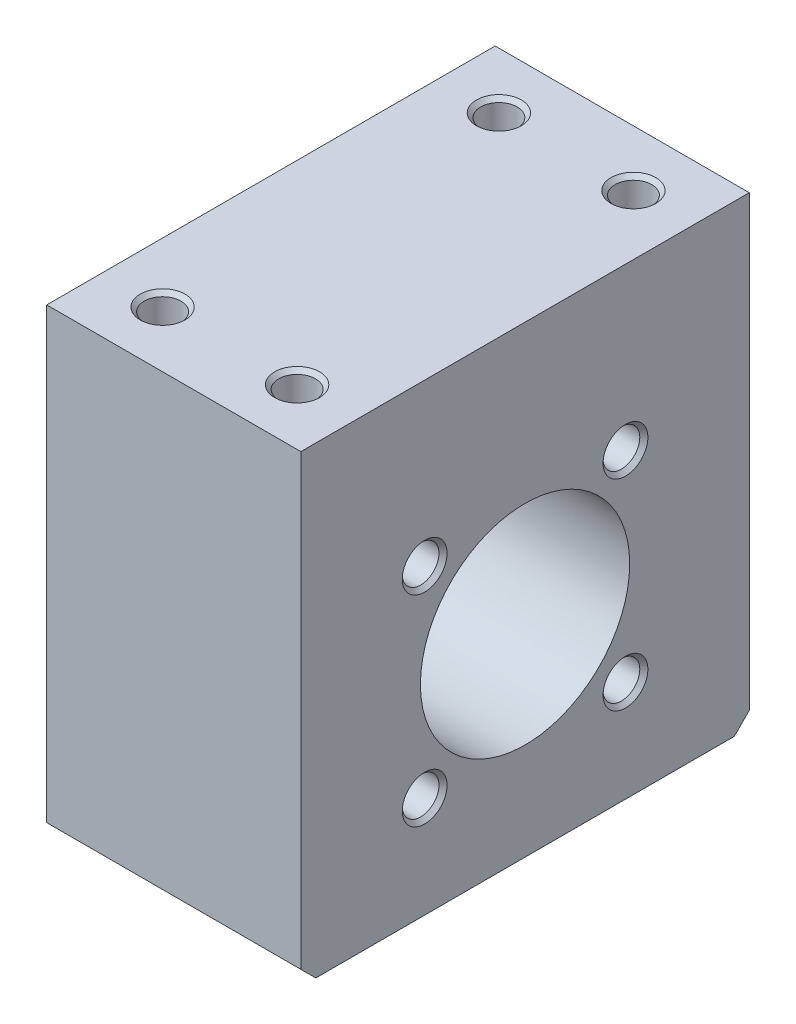
ISO-10303-21;
HEADER;
FILE_DESCRIPTION(('STEP AP214'),'2;1');
FILE_NAME('part.step','',(''),(''),'','','');
FILE_SCHEMA(('AUTOMOTIVE_DESIGN { 1 0 10303 214 1 1 1 1 }'));
ENDSEC;
DATA;
#1=APPLICATION_CONTEXT('core data for automotive mechanical design processes');
#2=APPLICATION_PROTOCOL_DEFINITION('international standard','automotive_design',2000,#1);
#3=PRODUCT_CONTEXT('',#1,'mechanical');
#4=PRODUCT('Part','Part','',(#3));
#5=PRODUCT_RELATED_PRODUCT_CATEGORY('part','',(#4));
#6=PRODUCT_DEFINITION_FORMATION('','',#4);
#7=PRODUCT_DEFINITION_CONTEXT('part definition',#1,'design');
#8=PRODUCT_DEFINITION('design','',#6,#7);
#9=PRODUCT_DEFINITION_SHAPE('','',#8);
#10=(LENGTH_UNIT() NAMED_UNIT(*) SI_UNIT(.MILLI.,.METRE.));
#11=(NAMED_UNIT(*) PLANE_ANGLE_UNIT() SI_UNIT($,.RADIAN.));
#12=(NAMED_UNIT(*) SI_UNIT($,.STERADIAN.) SOLID_ANGLE_UNIT());
#13=UNCERTAINTY_MEASURE_WITH_UNIT(LENGTH_MEASURE(1.E-05),#10,'distance_accuracy_value','');
#14=(GEOMETRIC_REPRESENTATION_CONTEXT(3) GLOBAL_UNCERTAINTY_ASSIGNED_CONTEXT((#13)) GLOBAL_UNIT_ASSIGNED_CONTEXT((#10,
#11,#12)) REPRESENTATION_CONTEXT('',''));
#15=CARTESIAN_POINT('',(0.,0.,0.));
#16=DIRECTION('',(0.,0.,1.));
#17=DIRECTION('',(1.,0.,0.));
#18=AXIS2_PLACEMENT_3D('',#15,#16,#17);
#19=CARTESIAN_POINT('',(-17.,-27.,30.));
#20=DIRECTION('',(0.,-1.,0.));
#21=DIRECTION('',(0.,0.,-1.));
#22=AXIS2_PLACEMENT_3D('',#19,#20,#21);
#23=PLANE('',#22);
#24=DIRECTION('',(0.,0.,-1.));
#25=VECTOR('',#24,1.);
#26=CARTESIAN_POINT('',(17.,-27.,30.));
#27=LINE('',#26,#25);
#28=CARTESIAN_POINT('',(17.,-27.,28.));
#29=VERTEX_POINT('',#28);
#30=CARTESIAN_POINT('',(17.,-27.,-28.));
#31=VERTEX_POINT('',#30);
#32=EDGE_CURVE('E149',#29,#31,#27,.T.);
#33=ORIENTED_EDGE('',*,*,#32,.F.);
#34=DIRECTION('',(-1.,0.,0.));
#35=VECTOR('',#34,1.);
#36=CARTESIAN_POINT('',(-17.,-27.,28.));
#37=LINE('',#36,#35);
#38=CARTESIAN_POINT('',(-17.,-27.,28.));
#39=VERTEX_POINT('',#38);
#40=EDGE_CURVE('E233',#29,#39,#37,.T.);
#41=ORIENTED_EDGE('',*,*,#40,.T.);
#42=DIRECTION('',(0.,0.,-1.));
#43=VECTOR('',#42,1.);
#44=CARTESIAN_POINT('',(-17.,-27.,30.));
#45=LINE('',#44,#43);
#46=CARTESIAN_POINT('',(-17.,-27.,-28.));
#47=VERTEX_POINT('',#46);
#48=EDGE_CURVE('E150',#39,#47,#45,.T.);
#49=ORIENTED_EDGE('',*,*,#48,.T.);
#50=DIRECTION('',(1.,0.,0.));
#51=VECTOR('',#50,1.);
#52=CARTESIAN_POINT('',(-17.,-27.,-28.));
#53=LINE('',#52,#51);
#54=EDGE_CURVE('E230',#47,#31,#53,.T.);
#55=ORIENTED_EDGE('',*,*,#54,.T.);
#56=EDGE_LOOP('',(#33,#41,#49,#55));
#57=FACE_BOUND('',#56,.T.);
#58=ADVANCED_FACE('F35',(#57),#23,.T.);
#59=CARTESIAN_POINT('',(-17.,35.,30.));
#60=DIRECTION('',(0.,0.,1.));
#61=DIRECTION('',(1.,0.,0.));
#62=AXIS2_PLACEMENT_3D('',#59,#60,#61);
#63=PLANE('',#62);
#64=DIRECTION('',(0.,-1.,0.));
#65=VECTOR('',#64,1.);
#66=CARTESIAN_POINT('',(-17.,35.,30.));
#67=LINE('',#66,#65);
#68=CARTESIAN_POINT('',(-17.,35.,30.));
#69=VERTEX_POINT('',#68);
#70=CARTESIAN_POINT('',(-17.,-25.,30.));
#71=VERTEX_POINT('',#70);
#72=EDGE_CURVE('E158',#69,#71,#67,.T.);
#73=ORIENTED_EDGE('',*,*,#72,.T.);
#74=DIRECTION('',(1.,0.,0.));
#75=VECTOR('',#74,1.);
#76=CARTESIAN_POINT('',(-17.,-25.,30.));
#77=LINE('',#76,#75);
#78=CARTESIAN_POINT('',(17.,-25.,30.));
#79=VERTEX_POINT('',#78);
#80=EDGE_CURVE('E223',#71,#79,#77,.T.);
#81=ORIENTED_EDGE('',*,*,#80,.T.);
#82=DIRECTION('',(0.,-1.,0.));
#83=VECTOR('',#82,1.);
#84=CARTESIAN_POINT('',(17.,35.,30.));
#85=LINE('',#84,#83);
#86=CARTESIAN_POINT('',(17.,35.,30.));
#87=VERTEX_POINT('',#86);
#88=EDGE_CURVE('E153',#87,#79,#85,.T.);
#89=ORIENTED_EDGE('',*,*,#88,.F.);
#90=DIRECTION('',(1.,0.,0.));
#91=VECTOR('',#90,1.);
#92=CARTESIAN_POINT('',(-17.,35.,30.));
#93=LINE('',#92,#91);
#94=EDGE_CURVE('E171',#69,#87,#93,.T.);
#95=ORIENTED_EDGE('',*,*,#94,.F.);
#96=EDGE_LOOP('',(#73,#81,#89,#95));
#97=FACE_BOUND('',#96,.T.);
#98=ADVANCED_FACE('F243',(#97),#63,.T.);
#99=CARTESIAN_POINT('',(-17.,35.,-30.));
#100=DIRECTION('',(0.,1.,0.));
#101=DIRECTION('',(0.,0.,1.));
#102=AXIS2_PLACEMENT_3D('',#99,#100,#101);
#103=PLANE('',#102);
#104=CARTESIAN_POINT('',(-9.,35.,22.5));
#105=DIRECTION('',(0.,1.,0.));
#106=DIRECTION('',(0.,0.,1.));
#107=AXIS2_PLACEMENT_3D('',#104,#105,#106);
#108=CIRCLE('',#107,3.00000000005395);
#109=CARTESIAN_POINT('',(-9.,35.,25.5000000000539));
#110=VERTEX_POINT('',#109);
#111=EDGE_CURVE('E187',#110,#110,#108,.F.);
#112=ORIENTED_EDGE('',*,*,#111,.T.);
#113=EDGE_LOOP('',(#112));
#114=FACE_BOUND('',#113,.T.);
#115=CARTESIAN_POINT('',(9.,35.,22.5));
#116=DIRECTION('',(0.,1.,0.));
#117=DIRECTION('',(0.,0.,1.));
#118=AXIS2_PLACEMENT_3D('',#115,#116,#117);
#119=CIRCLE('',#118,3.00000000005395);
#120=CARTESIAN_POINT('',(9.,35.,25.5000000000539));
#121=VERTEX_POINT('',#120);
#122=EDGE_CURVE('E184',#121,#121,#119,.F.);
#123=ORIENTED_EDGE('',*,*,#122,.T.);
#124=EDGE_LOOP('',(#123));
#125=FACE_BOUND('',#124,.T.);
#126=CARTESIAN_POINT('',(-9.,35.,-22.5));
#127=DIRECTION('',(0.,1.,0.));
#128=DIRECTION('',(0.,0.,1.));
#129=AXIS2_PLACEMENT_3D('',#126,#127,#128);
#130=CIRCLE('',#129,3.00000000005395);
#131=CARTESIAN_POINT('',(-9.,35.,-19.4999999999461));
#132=VERTEX_POINT('',#131);
#133=EDGE_CURVE('E181',#132,#132,#130,.F.);
#134=ORIENTED_EDGE('',*,*,#133,.T.);
#135=EDGE_LOOP('',(#134));
#136=FACE_BOUND('',#135,.T.);
#137=CARTESIAN_POINT('',(9.,35.,-22.5));
#138=DIRECTION('',(0.,1.,0.));
#139=DIRECTION('',(0.,0.,1.));
#140=AXIS2_PLACEMENT_3D('',#137,#138,#139);
#141=CIRCLE('',#140,3.00000000005395);
#142=CARTESIAN_POINT('',(9.,35.,-19.4999999999461));
#143=VERTEX_POINT('',#142);
#144=EDGE_CURVE('E178',#143,#143,#141,.F.);
#145=ORIENTED_EDGE('',*,*,#144,.T.);
#146=EDGE_LOOP('',(#145));
#147=FACE_BOUND('',#146,.T.);
#148=DIRECTION('',(0.,0.,1.));
#149=VECTOR('',#148,1.);
#150=CARTESIAN_POINT('',(17.,35.,-30.));
#151=LINE('',#150,#149);
#152=CARTESIAN_POINT('',(17.,35.,-30.));
#153=VERTEX_POINT('',#152);
#154=EDGE_CURVE('E166',#153,#87,#151,.T.);
#155=ORIENTED_EDGE('',*,*,#154,.F.);
#156=DIRECTION('',(1.,0.,0.));
#157=VECTOR('',#156,1.);
#158=CARTESIAN_POINT('',(-17.,35.,-30.));
#159=LINE('',#158,#157);
#160=CARTESIAN_POINT('',(-17.,35.,-30.));
#161=VERTEX_POINT('',#160);
#162=EDGE_CURVE('E161',#161,#153,#159,.T.);
#163=ORIENTED_EDGE('',*,*,#162,.F.);
#164=DIRECTION('',(0.,0.,1.));
#165=VECTOR('',#164,1.);
#166=CARTESIAN_POINT('',(-17.,35.,-30.));
#167=LINE('',#166,#165);
#168=EDGE_CURVE('E155',#161,#69,#167,.T.);
#169=ORIENTED_EDGE('',*,*,#168,.T.);
#170=ORIENTED_EDGE('',*,*,#94,.T.);
#171=EDGE_LOOP('',(#155,#163,#169,#170));
#172=FACE_BOUND('',#171,.T.);
#173=ADVANCED_FACE('F256',(#114,#125,#136,#147,#172),#103,.T.);
#174=CARTESIAN_POINT('',(-17.,-27.,-30.));
#175=DIRECTION('',(0.,0.,-1.));
#176=DIRECTION('',(-1.,0.,0.));
#177=AXIS2_PLACEMENT_3D('',#174,#175,#176);
#178=PLANE('',#177);
#179=DIRECTION('',(0.,1.,0.));
#180=VECTOR('',#179,1.);
#181=CARTESIAN_POINT('',(17.,-27.,-30.));
#182=LINE('',#181,#180);
#183=CARTESIAN_POINT('',(17.,-25.,-30.));
#184=VERTEX_POINT('',#183);
#185=EDGE_CURVE('E164',#184,#153,#182,.T.);
#186=ORIENTED_EDGE('',*,*,#185,.F.);
#187=DIRECTION('',(-1.,0.,0.));
#188=VECTOR('',#187,1.);
#189=CARTESIAN_POINT('',(-17.,-25.,-30.));
#190=LINE('',#189,#188);
#191=CARTESIAN_POINT('',(-17.,-25.,-30.));
#192=VERTEX_POINT('',#191);
#193=EDGE_CURVE('E11',#184,#192,#190,.T.);
#194=ORIENTED_EDGE('',*,*,#193,.T.);
#195=DIRECTION('',(0.,1.,0.));
#196=VECTOR('',#195,1.);
#197=CARTESIAN_POINT('',(-17.,-27.,-30.));
#198=LINE('',#197,#196);
#199=EDGE_CURVE('E152',#192,#161,#198,.T.);
#200=ORIENTED_EDGE('',*,*,#199,.T.);
#201=ORIENTED_EDGE('',*,*,#162,.T.);
#202=EDGE_LOOP('',(#186,#194,#200,#201));
#203=FACE_BOUND('',#202,.T.);
#204=ADVANCED_FACE('F252',(#203),#178,.T.);
#205=CARTESIAN_POINT('',(-17.,0.,0.));
#206=DIRECTION('',(1.,0.,0.));
#207=DIRECTION('',(0.,0.,-1.));
#208=AXIS2_PLACEMENT_3D('',#205,#206,#207);
#209=PLANE('',#208);
#210=CARTESIAN_POINT('',(-17.,0.,0.));
#211=DIRECTION('',(1.,0.,0.));
#212=DIRECTION('',(0.,0.,-1.));
#213=AXIS2_PLACEMENT_3D('',#210,#211,#212);
#214=CIRCLE('',#213,14.);
#215=CARTESIAN_POINT('',(-17.,0.,-14.));
#216=VERTEX_POINT('',#215);
#217=EDGE_CURVE('E146',#216,#216,#214,.T.);
#218=ORIENTED_EDGE('',*,*,#217,.T.);
#219=EDGE_LOOP('',(#218));
#220=FACE_BOUND('',#219,.T.);
#221=ORIENTED_EDGE('',*,*,#48,.F.);
#222=DIRECTION('',(0.,-0.707106781186546,-0.707106781186549));
#223=VECTOR('',#222,1.);
#224=CARTESIAN_POINT('',(-17.,-25.,30.));
#225=LINE('',#224,#223);
#226=EDGE_CURVE('E43',#39,#71,#225,.F.);
#227=ORIENTED_EDGE('',*,*,#226,.T.);
#228=ORIENTED_EDGE('',*,*,#72,.F.);
#229=ORIENTED_EDGE('',*,*,#168,.F.);
#230=ORIENTED_EDGE('',*,*,#199,.F.);
#231=DIRECTION('',(0.,0.70710678118655,-0.707106781186545));
#232=VECTOR('',#231,1.);
#233=CARTESIAN_POINT('',(-17.,-27.,-28.));
#234=LINE('',#233,#232);
#235=EDGE_CURVE('E55',#192,#47,#234,.F.);
#236=ORIENTED_EDGE('',*,*,#235,.T.);
#237=EDGE_LOOP('',(#221,#227,#228,#229,#230,#236));
#238=FACE_BOUND('',#237,.T.);
#239=ADVANCED_FACE('F237',(#220,#238),#209,.F.);
#240=CARTESIAN_POINT('',(17.,0.,0.));
#241=DIRECTION('',(1.,0.,0.));
#242=DIRECTION('',(0.,0.,-1.));
#243=AXIS2_PLACEMENT_3D('',#240,#241,#242);
#244=PLANE('',#243);
#245=CARTESIAN_POINT('',(17.,-13.4350288425444,13.4350288425444));
#246=DIRECTION('',(1.,0.,0.));
#247=DIRECTION('',(0.,0.,-1.));
#248=AXIS2_PLACEMENT_3D('',#245,#246,#247);
#249=CIRCLE('',#248,3.00000000005393);
#250=CARTESIAN_POINT('',(17.,-13.4350288425444,10.4350288424905));
#251=VERTEX_POINT('',#250);
#252=EDGE_CURVE('E205',#251,#251,#249,.F.);
#253=ORIENTED_EDGE('',*,*,#252,.T.);
#254=EDGE_LOOP('',(#253));
#255=FACE_BOUND('',#254,.T.);
#256=CARTESIAN_POINT('',(17.,-13.4350288425444,-13.4350288425444));
#257=DIRECTION('',(1.,0.,0.));
#258=DIRECTION('',(0.,0.,-1.));
#259=AXIS2_PLACEMENT_3D('',#256,#257,#258);
#260=CIRCLE('',#259,3.00000000005393);
#261=CARTESIAN_POINT('',(17.,-13.4350288425444,-16.4350288425983));
#262=VERTEX_POINT('',#261);
#263=EDGE_CURVE('E202',#262,#262,#260,.F.);
#264=ORIENTED_EDGE('',*,*,#263,.T.);
#265=EDGE_LOOP('',(#264));
#266=FACE_BOUND('',#265,.T.);
#267=CARTESIAN_POINT('',(17.,13.4350288425444,13.4350288425444));
#268=DIRECTION('',(1.,0.,0.));
#269=DIRECTION('',(0.,0.,-1.));
#270=AXIS2_PLACEMENT_3D('',#267,#268,#269);
#271=CIRCLE('',#270,3.00000000005393);
#272=CARTESIAN_POINT('',(17.,13.4350288425444,10.4350288424905));
#273=VERTEX_POINT('',#272);
#274=EDGE_CURVE('E199',#273,#273,#271,.F.);
#275=ORIENTED_EDGE('',*,*,#274,.T.);
#276=EDGE_LOOP('',(#275));
#277=FACE_BOUND('',#276,.T.);
#278=CARTESIAN_POINT('',(17.,13.4350288425444,-13.4350288425444));
#279=DIRECTION('',(1.,0.,0.));
#280=DIRECTION('',(0.,0.,-1.));
#281=AXIS2_PLACEMENT_3D('',#278,#279,#280);
#282=CIRCLE('',#281,3.00000000005393);
#283=CARTESIAN_POINT('',(17.,13.4350288425444,-16.4350288425983));
#284=VERTEX_POINT('',#283);
#285=EDGE_CURVE('E196',#284,#284,#282,.F.);
#286=ORIENTED_EDGE('',*,*,#285,.T.);
#287=EDGE_LOOP('',(#286));
#288=FACE_BOUND('',#287,.T.);
#289=CARTESIAN_POINT('',(17.,0.,0.));
#290=DIRECTION('',(1.,0.,0.));
#291=DIRECTION('',(0.,0.,-1.));
#292=AXIS2_PLACEMENT_3D('',#289,#290,#291);
#293=CIRCLE('',#292,14.);
#294=CARTESIAN_POINT('',(17.,0.,-14.));
#295=VERTEX_POINT('',#294);
#296=EDGE_CURVE('E143',#295,#295,#293,.T.);
#297=ORIENTED_EDGE('',*,*,#296,.F.);
#298=EDGE_LOOP('',(#297));
#299=FACE_BOUND('',#298,.T.);
#300=ORIENTED_EDGE('',*,*,#88,.T.);
#301=DIRECTION('',(0.,0.707106781186546,0.707106781186549));
#302=VECTOR('',#301,1.);
#303=CARTESIAN_POINT('',(17.,-27.5000000000001,27.4999999999999));
#304=LINE('',#303,#302);
#305=EDGE_CURVE('E228',#79,#29,#304,.F.);
#306=ORIENTED_EDGE('',*,*,#305,.T.);
#307=ORIENTED_EDGE('',*,*,#32,.T.);
#308=DIRECTION('',(0.,-0.70710678118655,0.707106781186545));
#309=VECTOR('',#308,1.);
#310=CARTESIAN_POINT('',(17.,-27.4999999999999,-27.5000000000001));
#311=LINE('',#310,#309);
#312=EDGE_CURVE('E226',#31,#184,#311,.F.);
#313=ORIENTED_EDGE('',*,*,#312,.T.);
#314=ORIENTED_EDGE('',*,*,#185,.T.);
#315=ORIENTED_EDGE('',*,*,#154,.T.);
#316=EDGE_LOOP('',(#300,#306,#307,#313,#314,#315));
#317=FACE_BOUND('',#316,.T.);
#318=ADVANCED_FACE('F248',(#255,#266,#277,#288,#299,#317),#244,.T.);
#319=CARTESIAN_POINT('',(17.,0.,0.));
#320=DIRECTION('',(1.,0.,0.));
#321=DIRECTION('',(0.,0.,-1.));
#322=AXIS2_PLACEMENT_3D('',#319,#320,#321);
#323=CYLINDRICAL_SURFACE('',#322,14.);
#324=ORIENTED_EDGE('',*,*,#217,.F.);
#325=EDGE_LOOP('',(#324));
#326=FACE_BOUND('',#325,.T.);
#327=ORIENTED_EDGE('',*,*,#296,.T.);
#328=EDGE_LOOP('',(#327));
#329=FACE_BOUND('',#328,.T.);
#330=ADVANCED_FACE('F323',(#326,#329),#323,.F.);
#331=CARTESIAN_POINT('',(-9.,20.6873648292338,22.5));
#332=DIRECTION('',(0.,1.,0.));
#333=DIRECTION('',(0.,0.,1.));
#334=AXIS2_PLACEMENT_3D('',#331,#332,#333);
#335=CONICAL_SURFACE('',#334,2.4585,1.04719755108974);
#336=CARTESIAN_POINT('',(-9.,19.2679491920808,22.5));
#337=VERTEX_POINT('',#336);
#338=VERTEX_LOOP('',#337);
#339=FACE_BOUND('',#338,.T.);
#340=CARTESIAN_POINT('',(-9.,20.6873648292338,22.5));
#341=DIRECTION('',(0.,1.,0.));
#342=DIRECTION('',(0.,0.,1.));
#343=AXIS2_PLACEMENT_3D('',#340,#341,#342);
#344=CIRCLE('',#343,2.4585);
#345=CARTESIAN_POINT('',(-9.,20.6873648292338,24.9585));
#346=VERTEX_POINT('',#345);
#347=EDGE_CURVE('E140',#346,#346,#344,.T.);
#348=ORIENTED_EDGE('',*,*,#347,.T.);
#349=EDGE_LOOP('',(#348));
#350=FACE_BOUND('',#349,.T.);
#351=ADVANCED_FACE('F495',(#339,#350),#335,.F.);
#352=CARTESIAN_POINT('',(-9.,35.,22.5));
#353=DIRECTION('',(0.,1.,0.));
#354=DIRECTION('',(0.,0.,1.));
#355=AXIS2_PLACEMENT_3D('',#352,#353,#354);
#356=CYLINDRICAL_SURFACE('',#355,2.4585);
#357=CARTESIAN_POINT('',(-9.,34.4584999999461,22.5));
#358=DIRECTION('',(0.,1.,0.));
#359=DIRECTION('',(0.,0.,1.));
#360=AXIS2_PLACEMENT_3D('',#357,#358,#359);
#361=CIRCLE('',#360,2.4585);
#362=CARTESIAN_POINT('',(-9.,34.4584999999461,24.9585));
#363=VERTEX_POINT('',#362);
#364=EDGE_CURVE('E173',#363,#363,#361,.T.);
#365=ORIENTED_EDGE('',*,*,#364,.T.);
#366=EDGE_LOOP('',(#365));
#367=FACE_BOUND('',#366,.T.);
#368=ORIENTED_EDGE('',*,*,#347,.F.);
#369=EDGE_LOOP('',(#368));
#370=FACE_BOUND('',#369,.T.);
#371=ADVANCED_FACE('F491',(#367,#370),#356,.F.);
#372=CARTESIAN_POINT('',(-9.,20.6873648292338,-22.5));
#373=DIRECTION('',(0.,1.,0.));
#374=DIRECTION('',(0.,0.,1.));
#375=AXIS2_PLACEMENT_3D('',#372,#373,#374);
#376=CONICAL_SURFACE('',#375,2.4585,1.04719755108974);
#377=CARTESIAN_POINT('',(-9.,19.2679491920808,-22.5));
#378=VERTEX_POINT('',#377);
#379=VERTEX_LOOP('',#378);
#380=FACE_BOUND('',#379,.T.);
#381=CARTESIAN_POINT('',(-9.,20.6873648292338,-22.5));
#382=DIRECTION('',(0.,1.,0.));
#383=DIRECTION('',(0.,0.,1.));
#384=AXIS2_PLACEMENT_3D('',#381,#382,#383);
#385=CIRCLE('',#384,2.4585);
#386=CARTESIAN_POINT('',(-9.,20.6873648292338,-20.0415));
#387=VERTEX_POINT('',#386);
#388=EDGE_CURVE('E137',#387,#387,#385,.T.);
#389=ORIENTED_EDGE('',*,*,#388,.T.);
#390=EDGE_LOOP('',(#389));
#391=FACE_BOUND('',#390,.T.);
#392=ADVANCED_FACE('F483',(#380,#391),#376,.F.);
#393=CARTESIAN_POINT('',(-9.,35.,-22.5));
#394=DIRECTION('',(0.,1.,0.));
#395=DIRECTION('',(0.,0.,1.));
#396=AXIS2_PLACEMENT_3D('',#393,#394,#395);
#397=CYLINDRICAL_SURFACE('',#396,2.4585);
#398=CARTESIAN_POINT('',(-9.,34.4584999999461,-22.5));
#399=DIRECTION('',(0.,1.,0.));
#400=DIRECTION('',(0.,0.,1.));
#401=AXIS2_PLACEMENT_3D('',#398,#399,#400);
#402=CIRCLE('',#401,2.4585);
#403=CARTESIAN_POINT('',(-9.,34.4584999999461,-20.0415));
#404=VERTEX_POINT('',#403);
#405=EDGE_CURVE('E208',#404,#404,#402,.T.);
#406=ORIENTED_EDGE('',*,*,#405,.T.);
#407=EDGE_LOOP('',(#406));
#408=FACE_BOUND('',#407,.T.);
#409=ORIENTED_EDGE('',*,*,#388,.F.);
#410=EDGE_LOOP('',(#409));
#411=FACE_BOUND('',#410,.T.);
#412=ADVANCED_FACE('F478',(#408,#411),#397,.F.);
#413=CARTESIAN_POINT('',(9.,20.6873648292338,22.5));
#414=DIRECTION('',(0.,1.,0.));
#415=DIRECTION('',(0.,0.,1.));
#416=AXIS2_PLACEMENT_3D('',#413,#414,#415);
#417=CONICAL_SURFACE('',#416,2.4585,1.04719755108974);
#418=CARTESIAN_POINT('',(9.,19.2679491920808,22.5));
#419=VERTEX_POINT('',#418);
#420=VERTEX_LOOP('',#419);
#421=FACE_BOUND('',#420,.T.);
#422=CARTESIAN_POINT('',(9.,20.6873648292338,22.5));
#423=DIRECTION('',(0.,1.,0.));
#424=DIRECTION('',(0.,0.,1.));
#425=AXIS2_PLACEMENT_3D('',#422,#423,#424);
#426=CIRCLE('',#425,2.4585);
#427=CARTESIAN_POINT('',(9.,20.6873648292338,24.9585));
#428=VERTEX_POINT('',#427);
#429=EDGE_CURVE('E134',#428,#428,#426,.T.);
#430=ORIENTED_EDGE('',*,*,#429,.T.);
#431=EDGE_LOOP('',(#430));
#432=FACE_BOUND('',#431,.T.);
#433=ADVANCED_FACE('F470',(#421,#432),#417,.F.);
#434=CARTESIAN_POINT('',(9.,35.,22.5));
#435=DIRECTION('',(0.,1.,0.));
#436=DIRECTION('',(0.,0.,1.));
#437=AXIS2_PLACEMENT_3D('',#434,#435,#436);
#438=CYLINDRICAL_SURFACE('',#437,2.4585);
#439=CARTESIAN_POINT('',(9.,34.4584999999461,22.5));
#440=DIRECTION('',(0.,1.,0.));
#441=DIRECTION('',(0.,0.,1.));
#442=AXIS2_PLACEMENT_3D('',#439,#440,#441);
#443=CIRCLE('',#442,2.4585);
#444=CARTESIAN_POINT('',(9.,34.4584999999461,24.9585));
#445=VERTEX_POINT('',#444);
#446=EDGE_CURVE('E190',#445,#445,#443,.T.);
#447=ORIENTED_EDGE('',*,*,#446,.T.);
#448=EDGE_LOOP('',(#447));
#449=FACE_BOUND('',#448,.T.);
#450=ORIENTED_EDGE('',*,*,#429,.F.);
#451=EDGE_LOOP('',(#450));
#452=FACE_BOUND('',#451,.T.);
#453=ADVANCED_FACE('F465',(#449,#452),#438,.F.);
#454=CARTESIAN_POINT('',(9.,20.6873648292338,-22.5));
#455=DIRECTION('',(0.,1.,0.));
#456=DIRECTION('',(0.,0.,1.));
#457=AXIS2_PLACEMENT_3D('',#454,#455,#456);
#458=CONICAL_SURFACE('',#457,2.4585,1.04719755108974);
#459=CARTESIAN_POINT('',(9.,19.2679491920808,-22.5));
#460=VERTEX_POINT('',#459);
#461=VERTEX_LOOP('',#460);
#462=FACE_BOUND('',#461,.T.);
#463=CARTESIAN_POINT('',(9.,20.6873648292338,-22.5));
#464=DIRECTION('',(0.,1.,0.));
#465=DIRECTION('',(0.,0.,1.));
#466=AXIS2_PLACEMENT_3D('',#463,#464,#465);
#467=CIRCLE('',#466,2.4585);
#468=CARTESIAN_POINT('',(9.,20.6873648292338,-20.0415));
#469=VERTEX_POINT('',#468);
#470=EDGE_CURVE('E131',#469,#469,#467,.T.);
#471=ORIENTED_EDGE('',*,*,#470,.T.);
#472=EDGE_LOOP('',(#471));
#473=FACE_BOUND('',#472,.T.);
#474=ADVANCED_FACE('F457',(#462,#473),#458,.F.);
#475=CARTESIAN_POINT('',(9.,35.,-22.5));
#476=DIRECTION('',(0.,1.,0.));
#477=DIRECTION('',(0.,0.,1.));
#478=AXIS2_PLACEMENT_3D('',#475,#476,#477);
#479=CYLINDRICAL_SURFACE('',#478,2.4585);
#480=CARTESIAN_POINT('',(9.,34.4584999999461,-22.5));
#481=DIRECTION('',(0.,1.,0.));
#482=DIRECTION('',(0.,0.,1.));
#483=AXIS2_PLACEMENT_3D('',#480,#481,#482);
#484=CIRCLE('',#483,2.4585);
#485=CARTESIAN_POINT('',(9.,34.4584999999461,-20.0415));
#486=VERTEX_POINT('',#485);
#487=EDGE_CURVE('E220',#486,#486,#484,.T.);
#488=ORIENTED_EDGE('',*,*,#487,.T.);
#489=EDGE_LOOP('',(#488));
#490=FACE_BOUND('',#489,.T.);
#491=ORIENTED_EDGE('',*,*,#470,.F.);
#492=EDGE_LOOP('',(#491));
#493=FACE_BOUND('',#492,.T.);
#494=ADVANCED_FACE('F452',(#490,#493),#479,.F.);
#495=CARTESIAN_POINT('',(4.68736482923382,13.4350288425444,13.4350288425444));
#496=DIRECTION('',(1.,0.,0.));
#497=DIRECTION('',(0.,0.,-1.));
#498=AXIS2_PLACEMENT_3D('',#495,#496,#497);
#499=CONICAL_SURFACE('',#498,2.4585,1.04719755105556);
#500=CARTESIAN_POINT('',(3.26794919196881,13.4350288425444,13.4350288425444));
#501=VERTEX_POINT('',#500);
#502=VERTEX_LOOP('',#501);
#503=FACE_BOUND('',#502,.T.);
#504=CARTESIAN_POINT('',(4.68736482923382,13.4350288425444,13.4350288425444));
#505=DIRECTION('',(1.,0.,0.));
#506=DIRECTION('',(0.,0.,-1.));
#507=AXIS2_PLACEMENT_3D('',#504,#505,#506);
#508=CIRCLE('',#507,2.4585);
#509=CARTESIAN_POINT('',(4.68736482923382,13.4350288425444,10.9765288425444));
#510=VERTEX_POINT('',#509);
#511=EDGE_CURVE('E128',#510,#510,#508,.T.);
#512=ORIENTED_EDGE('',*,*,#511,.T.);
#513=EDGE_LOOP('',(#512));
#514=FACE_BOUND('',#513,.T.);
#515=ADVANCED_FACE('F444',(#503,#514),#499,.F.);
#516=CARTESIAN_POINT('',(17.,13.4350288425444,13.4350288425444));
#517=DIRECTION('',(1.,0.,0.));
#518=DIRECTION('',(0.,0.,-1.));
#519=AXIS2_PLACEMENT_3D('',#516,#517,#518);
#520=CYLINDRICAL_SURFACE('',#519,2.4585);
#521=CARTESIAN_POINT('',(16.4584999999461,13.4350288425444,13.4350288425444));
#522=DIRECTION('',(1.,0.,0.));
#523=DIRECTION('',(0.,0.,-1.));
#524=AXIS2_PLACEMENT_3D('',#521,#522,#523);
#525=CIRCLE('',#524,2.4585);
#526=CARTESIAN_POINT('',(16.4584999999461,13.4350288425444,10.9765288425444));
#527=VERTEX_POINT('',#526);
#528=EDGE_CURVE('E214',#527,#527,#525,.T.);
#529=ORIENTED_EDGE('',*,*,#528,.T.);
#530=EDGE_LOOP('',(#529));
#531=FACE_BOUND('',#530,.T.);
#532=ORIENTED_EDGE('',*,*,#511,.F.);
#533=EDGE_LOOP('',(#532));
#534=FACE_BOUND('',#533,.T.);
#535=ADVANCED_FACE('F439',(#531,#534),#520,.F.);
#536=CARTESIAN_POINT('',(4.68736482923382,-13.4350288425444,-13.4350288425444));
#537=DIRECTION('',(1.,0.,0.));
#538=DIRECTION('',(0.,0.,-1.));
#539=AXIS2_PLACEMENT_3D('',#536,#537,#538);
#540=CONICAL_SURFACE('',#539,2.4585,1.04719755105556);
#541=CARTESIAN_POINT('',(3.26794919196881,-13.4350288425444,-13.4350288425444));
#542=VERTEX_POINT('',#541);
#543=VERTEX_LOOP('',#542);
#544=FACE_BOUND('',#543,.T.);
#545=CARTESIAN_POINT('',(4.68736482923382,-13.4350288425444,-13.4350288425444));
#546=DIRECTION('',(1.,0.,0.));
#547=DIRECTION('',(0.,0.,-1.));
#548=AXIS2_PLACEMENT_3D('',#545,#546,#547);
#549=CIRCLE('',#548,2.4585);
#550=CARTESIAN_POINT('',(4.68736482923382,-13.4350288425444,-15.8935288425444));
#551=VERTEX_POINT('',#550);
#552=EDGE_CURVE('E123',#551,#551,#549,.T.);
#553=ORIENTED_EDGE('',*,*,#552,.T.);
#554=EDGE_LOOP('',(#553));
#555=FACE_BOUND('',#554,.T.);
#556=ADVANCED_FACE('F431',(#544,#555),#540,.F.);
#557=CARTESIAN_POINT('',(17.,-13.4350288425444,-13.4350288425444));
#558=DIRECTION('',(1.,0.,0.));
#559=DIRECTION('',(0.,0.,-1.));
#560=AXIS2_PLACEMENT_3D('',#557,#558,#559);
#561=CYLINDRICAL_SURFACE('',#560,2.4585);
#562=CARTESIAN_POINT('',(16.4584999999461,-13.4350288425444,-13.4350288425444));
#563=DIRECTION('',(1.,0.,0.));
#564=DIRECTION('',(0.,0.,-1.));
#565=AXIS2_PLACEMENT_3D('',#562,#563,#564);
#566=CIRCLE('',#565,2.4585);
#567=CARTESIAN_POINT('',(16.4584999999461,-13.4350288425444,-15.8935288425444));
#568=VERTEX_POINT('',#567);
#569=EDGE_CURVE('E211',#568,#568,#566,.T.);
#570=ORIENTED_EDGE('',*,*,#569,.T.);
#571=EDGE_LOOP('',(#570));
#572=FACE_BOUND('',#571,.T.);
#573=ORIENTED_EDGE('',*,*,#552,.F.);
#574=EDGE_LOOP('',(#573));
#575=FACE_BOUND('',#574,.T.);
#576=ADVANCED_FACE('F426',(#572,#575),#561,.F.);
#577=CARTESIAN_POINT('',(4.68736482923382,-13.4350288425444,13.4350288425444));
#578=DIRECTION('',(1.,0.,0.));
#579=DIRECTION('',(0.,0.,-1.));
#580=AXIS2_PLACEMENT_3D('',#577,#578,#579);
#581=CONICAL_SURFACE('',#580,2.4585,1.04719755105556);
#582=CARTESIAN_POINT('',(3.26794919196881,-13.4350288425444,13.4350288425444));
#583=VERTEX_POINT('',#582);
#584=VERTEX_LOOP('',#583);
#585=FACE_BOUND('',#584,.T.);
#586=CARTESIAN_POINT('',(4.68736482923382,-13.4350288425444,13.4350288425444));
#587=DIRECTION('',(1.,0.,0.));
#588=DIRECTION('',(0.,0.,-1.));
#589=AXIS2_PLACEMENT_3D('',#586,#587,#588);
#590=CIRCLE('',#589,2.4585);
#591=CARTESIAN_POINT('',(4.68736482923382,-13.4350288425444,10.9765288425444));
#592=VERTEX_POINT('',#591);
#593=EDGE_CURVE('E120',#592,#592,#590,.T.);
#594=ORIENTED_EDGE('',*,*,#593,.T.);
#595=EDGE_LOOP('',(#594));
#596=FACE_BOUND('',#595,.T.);
#597=ADVANCED_FACE('F418',(#585,#596),#581,.F.);
#598=CARTESIAN_POINT('',(17.,-13.4350288425444,13.4350288425444));
#599=DIRECTION('',(1.,0.,0.));
#600=DIRECTION('',(0.,0.,-1.));
#601=AXIS2_PLACEMENT_3D('',#598,#599,#600);
#602=CYLINDRICAL_SURFACE('',#601,2.4585);
#603=CARTESIAN_POINT('',(16.4584999999461,-13.4350288425444,13.4350288425444));
#604=DIRECTION('',(1.,0.,0.));
#605=DIRECTION('',(0.,0.,-1.));
#606=AXIS2_PLACEMENT_3D('',#603,#604,#605);
#607=CIRCLE('',#606,2.4585);
#608=CARTESIAN_POINT('',(16.4584999999461,-13.4350288425444,10.9765288425444));
#609=VERTEX_POINT('',#608);
#610=EDGE_CURVE('E193',#609,#609,#607,.T.);
#611=ORIENTED_EDGE('',*,*,#610,.T.);
#612=EDGE_LOOP('',(#611));
#613=FACE_BOUND('',#612,.T.);
#614=ORIENTED_EDGE('',*,*,#593,.F.);
#615=EDGE_LOOP('',(#614));
#616=FACE_BOUND('',#615,.T.);
#617=ADVANCED_FACE('F114',(#613,#616),#602,.F.);
#618=CARTESIAN_POINT('',(4.68736482923382,13.4350288425444,-13.4350288425444));
#619=DIRECTION('',(1.,0.,0.));
#620=DIRECTION('',(0.,0.,-1.));
#621=AXIS2_PLACEMENT_3D('',#618,#619,#620);
#622=CONICAL_SURFACE('',#621,2.4585,1.04719755105556);
#623=CARTESIAN_POINT('',(3.26794919196881,13.4350288425444,-13.4350288425444));
#624=VERTEX_POINT('',#623);
#625=VERTEX_LOOP('',#624);
#626=FACE_BOUND('',#625,.T.);
#627=CARTESIAN_POINT('',(4.68736482923382,13.4350288425444,-13.4350288425444));
#628=DIRECTION('',(1.,0.,0.));
#629=DIRECTION('',(0.,0.,-1.));
#630=AXIS2_PLACEMENT_3D('',#627,#628,#629);
#631=CIRCLE('',#630,2.4585);
#632=CARTESIAN_POINT('',(4.68736482923382,13.4350288425444,-15.8935288425444));
#633=VERTEX_POINT('',#632);
#634=EDGE_CURVE('E118',#633,#633,#631,.T.);
#635=ORIENTED_EDGE('',*,*,#634,.T.);
#636=EDGE_LOOP('',(#635));
#637=FACE_BOUND('',#636,.T.);
#638=ADVANCED_FACE('F110',(#626,#637),#622,.F.);
#639=CARTESIAN_POINT('',(17.,13.4350288425444,-13.4350288425444));
#640=DIRECTION('',(1.,0.,0.));
#641=DIRECTION('',(0.,0.,-1.));
#642=AXIS2_PLACEMENT_3D('',#639,#640,#641);
#643=CYLINDRICAL_SURFACE('',#642,2.4585);
#644=CARTESIAN_POINT('',(16.4584999999461,13.4350288425444,-13.4350288425444));
#645=DIRECTION('',(1.,0.,0.));
#646=DIRECTION('',(0.,0.,-1.));
#647=AXIS2_PLACEMENT_3D('',#644,#645,#646);
#648=CIRCLE('',#647,2.4585);
#649=CARTESIAN_POINT('',(16.4584999999461,13.4350288425444,-15.8935288425444));
#650=VERTEX_POINT('',#649);
#651=EDGE_CURVE('E217',#650,#650,#648,.T.);
#652=ORIENTED_EDGE('',*,*,#651,.T.);
#653=EDGE_LOOP('',(#652));
#654=FACE_BOUND('',#653,.T.);
#655=ORIENTED_EDGE('',*,*,#634,.F.);
#656=EDGE_LOOP('',(#655));
#657=FACE_BOUND('',#656,.T.);
#658=ADVANCED_FACE('F113',(#654,#657),#643,.F.);
#659=CARTESIAN_POINT('',(-9.,34.4584999999461,22.5));
#660=DIRECTION('',(0.,1.,0.));
#661=DIRECTION('',(0.,0.,1.));
#662=AXIS2_PLACEMENT_3D('',#659,#660,#661);
#663=CONICAL_SURFACE('',#662,2.4585,0.785398163397446);
#664=ORIENTED_EDGE('',*,*,#111,.F.);
#665=EDGE_LOOP('',(#664));
#666=FACE_BOUND('',#665,.T.);
#667=ORIENTED_EDGE('',*,*,#364,.F.);
#668=EDGE_LOOP('',(#667));
#669=FACE_BOUND('',#668,.T.);
#670=ADVANCED_FACE('F272',(#666,#669),#663,.F.);
#671=CARTESIAN_POINT('',(9.,34.4584999999461,22.5));
#672=DIRECTION('',(0.,1.,0.));
#673=DIRECTION('',(0.,0.,1.));
#674=AXIS2_PLACEMENT_3D('',#671,#672,#673);
#675=CONICAL_SURFACE('',#674,2.4585,0.785398163397446);
#676=ORIENTED_EDGE('',*,*,#122,.F.);
#677=EDGE_LOOP('',(#676));
#678=FACE_BOUND('',#677,.T.);
#679=ORIENTED_EDGE('',*,*,#446,.F.);
#680=EDGE_LOOP('',(#679));
#681=FACE_BOUND('',#680,.T.);
#682=ADVANCED_FACE('F275',(#678,#681),#675,.F.);
#683=CARTESIAN_POINT('',(16.4584999999461,-13.4350288425444,13.4350288425444));
#684=DIRECTION('',(1.,0.,0.));
#685=DIRECTION('',(0.,0.,-1.));
#686=AXIS2_PLACEMENT_3D('',#683,#684,#685);
#687=CONICAL_SURFACE('',#686,2.4585,0.785398163397459);
#688=ORIENTED_EDGE('',*,*,#252,.F.);
#689=EDGE_LOOP('',(#688));
#690=FACE_BOUND('',#689,.T.);
#691=ORIENTED_EDGE('',*,*,#610,.F.);
#692=EDGE_LOOP('',(#691));
#693=FACE_BOUND('',#692,.T.);
#694=ADVANCED_FACE('F279',(#690,#693),#687,.F.);
#695=CARTESIAN_POINT('',(-9.,34.4584999999461,-22.5));
#696=DIRECTION('',(0.,1.,0.));
#697=DIRECTION('',(0.,0.,1.));
#698=AXIS2_PLACEMENT_3D('',#695,#696,#697);
#699=CONICAL_SURFACE('',#698,2.4585,0.785398163397446);
#700=ORIENTED_EDGE('',*,*,#133,.F.);
#701=EDGE_LOOP('',(#700));
#702=FACE_BOUND('',#701,.T.);
#703=ORIENTED_EDGE('',*,*,#405,.F.);
#704=EDGE_LOOP('',(#703));
#705=FACE_BOUND('',#704,.T.);
#706=ADVANCED_FACE('F283',(#702,#705),#699,.F.);
#707=CARTESIAN_POINT('',(16.4584999999461,-13.4350288425444,-13.4350288425444));
#708=DIRECTION('',(1.,0.,0.));
#709=DIRECTION('',(0.,0.,-1.));
#710=AXIS2_PLACEMENT_3D('',#707,#708,#709);
#711=CONICAL_SURFACE('',#710,2.4585,0.785398163397459);
#712=ORIENTED_EDGE('',*,*,#263,.F.);
#713=EDGE_LOOP('',(#712));
#714=FACE_BOUND('',#713,.T.);
#715=ORIENTED_EDGE('',*,*,#569,.F.);
#716=EDGE_LOOP('',(#715));
#717=FACE_BOUND('',#716,.T.);
#718=ADVANCED_FACE('F287',(#714,#717),#711,.F.);
#719=CARTESIAN_POINT('',(16.4584999999461,13.4350288425444,13.4350288425444));
#720=DIRECTION('',(1.,0.,0.));
#721=DIRECTION('',(0.,0.,-1.));
#722=AXIS2_PLACEMENT_3D('',#719,#720,#721);
#723=CONICAL_SURFACE('',#722,2.4585,0.785398163397458);
#724=ORIENTED_EDGE('',*,*,#274,.F.);
#725=EDGE_LOOP('',(#724));
#726=FACE_BOUND('',#725,.T.);
#727=ORIENTED_EDGE('',*,*,#528,.F.);
#728=EDGE_LOOP('',(#727));
#729=FACE_BOUND('',#728,.T.);
#730=ADVANCED_FACE('F291',(#726,#729),#723,.F.);
#731=CARTESIAN_POINT('',(16.4584999999461,13.4350288425444,-13.4350288425444));
#732=DIRECTION('',(1.,0.,0.));
#733=DIRECTION('',(0.,0.,-1.));
#734=AXIS2_PLACEMENT_3D('',#731,#732,#733);
#735=CONICAL_SURFACE('',#734,2.4585,0.785398163397458);
#736=ORIENTED_EDGE('',*,*,#285,.F.);
#737=EDGE_LOOP('',(#736));
#738=FACE_BOUND('',#737,.T.);
#739=ORIENTED_EDGE('',*,*,#651,.F.);
#740=EDGE_LOOP('',(#739));
#741=FACE_BOUND('',#740,.T.);
#742=ADVANCED_FACE('F295',(#738,#741),#735,.F.);
#743=CARTESIAN_POINT('',(9.,34.4584999999461,-22.5));
#744=DIRECTION('',(0.,1.,0.));
#745=DIRECTION('',(0.,0.,1.));
#746=AXIS2_PLACEMENT_3D('',#743,#744,#745);
#747=CONICAL_SURFACE('',#746,2.4585,0.785398163397446);
#748=ORIENTED_EDGE('',*,*,#144,.F.);
#749=EDGE_LOOP('',(#748));
#750=FACE_BOUND('',#749,.T.);
#751=ORIENTED_EDGE('',*,*,#487,.F.);
#752=EDGE_LOOP('',(#751));
#753=FACE_BOUND('',#752,.T.);
#754=ADVANCED_FACE('F299',(#750,#753),#747,.F.);
#755=CARTESIAN_POINT('',(-17.,-25.,30.));
#756=DIRECTION('',(0.,0.707106781186549,-0.707106781186546));
#757=DIRECTION('',(1.,0.,0.));
#758=AXIS2_PLACEMENT_3D('',#755,#756,#757);
#759=PLANE('',#758);
#760=ORIENTED_EDGE('',*,*,#226,.F.);
#761=ORIENTED_EDGE('',*,*,#40,.F.);
#762=ORIENTED_EDGE('',*,*,#305,.F.);
#763=ORIENTED_EDGE('',*,*,#80,.F.);
#764=EDGE_LOOP('',(#760,#761,#762,#763));
#765=FACE_BOUND('',#764,.T.);
#766=ADVANCED_FACE('F245',(#765),#759,.F.);
#767=CARTESIAN_POINT('',(-17.,-27.,-28.));
#768=DIRECTION('',(0.,0.707106781186545,0.70710678118655));
#769=DIRECTION('',(1.,0.,0.));
#770=AXIS2_PLACEMENT_3D('',#767,#768,#769);
#771=PLANE('',#770);
#772=ORIENTED_EDGE('',*,*,#235,.F.);
#773=ORIENTED_EDGE('',*,*,#193,.F.);
#774=ORIENTED_EDGE('',*,*,#312,.F.);
#775=ORIENTED_EDGE('',*,*,#54,.F.);
#776=EDGE_LOOP('',(#772,#773,#774,#775));
#777=FACE_BOUND('',#776,.T.);
#778=ADVANCED_FACE('F37',(#777),#771,.F.);
#779=CLOSED_SHELL('',(#58,#98,#173,#204,#239,#318,#330,#351,#371,#392,#412,#433,#453,#474,#494,
#515,#535,#556,#576,#597,#617,#638,#658,#670,#682,#694,#706,#718,#730,#742,#754,#766,#778));
#780=MANIFOLD_SOLID_BREP('B2',#779);
#781=ADVANCED_BREP_SHAPE_REPRESENTATION('',(#18,#780),#14);
#782=SHAPE_DEFINITION_REPRESENTATION(#9,#781);
ENDSEC;
END-ISO-10303-21;
